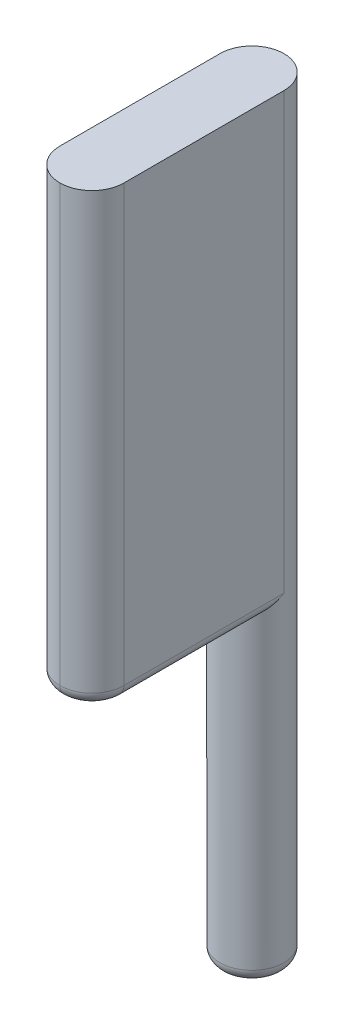
ISO-10303-21;
HEADER;
FILE_DESCRIPTION(('STEP AP214'),'2;1');
FILE_NAME('part.step','',(''),(''),'','','');
FILE_SCHEMA(('AUTOMOTIVE_DESIGN { 1 0 10303 214 1 1 1 1 }'));
ENDSEC;
DATA;
#1=APPLICATION_CONTEXT('core data for automotive mechanical design processes');
#2=APPLICATION_PROTOCOL_DEFINITION('international standard','automotive_design',2000,#1);
#3=PRODUCT_CONTEXT('',#1,'mechanical');
#4=PRODUCT('Part','Part','',(#3));
#5=PRODUCT_RELATED_PRODUCT_CATEGORY('part','',(#4));
#6=PRODUCT_DEFINITION_FORMATION('','',#4);
#7=PRODUCT_DEFINITION_CONTEXT('part definition',#1,'design');
#8=PRODUCT_DEFINITION('design','',#6,#7);
#9=PRODUCT_DEFINITION_SHAPE('','',#8);
#10=(LENGTH_UNIT() NAMED_UNIT(*) SI_UNIT(.MILLI.,.METRE.));
#11=(NAMED_UNIT(*) PLANE_ANGLE_UNIT() SI_UNIT($,.RADIAN.));
#12=(NAMED_UNIT(*) SI_UNIT($,.STERADIAN.) SOLID_ANGLE_UNIT());
#13=UNCERTAINTY_MEASURE_WITH_UNIT(LENGTH_MEASURE(1.E-05),#10,'distance_accuracy_value','');
#14=(GEOMETRIC_REPRESENTATION_CONTEXT(3) GLOBAL_UNCERTAINTY_ASSIGNED_CONTEXT((#13)) GLOBAL_UNIT_ASSIGNED_CONTEXT((#10,
#11,#12)) REPRESENTATION_CONTEXT('',''));
#15=CARTESIAN_POINT('',(0.,0.,0.));
#16=DIRECTION('',(0.,0.,1.));
#17=DIRECTION('',(1.,0.,0.));
#18=AXIS2_PLACEMENT_3D('',#15,#16,#17);
#19=CARTESIAN_POINT('',(0.,50.,0.));
#20=DIRECTION('',(0.,-1.,0.));
#21=DIRECTION('',(0.,0.,-1.));
#22=AXIS2_PLACEMENT_3D('',#19,#20,#21);
#23=CYLINDRICAL_SURFACE('',#22,5.);
#24=CARTESIAN_POINT('',(0.,2.,0.));
#25=DIRECTION('',(0.,1.,0.));
#26=DIRECTION('',(0.,0.,1.));
#27=AXIS2_PLACEMENT_3D('',#24,#25,#26);
#28=CIRCLE('',#27,5.);
#29=CARTESIAN_POINT('',(0.,2.,5.));
#30=VERTEX_POINT('',#29);
#31=EDGE_CURVE('E53',#30,#30,#28,.T.);
#32=ORIENTED_EDGE('',*,*,#31,.T.);
#33=EDGE_LOOP('',(#32));
#34=FACE_BOUND('',#33,.T.);
#35=CARTESIAN_POINT('',(0.,50.,0.));
#36=DIRECTION('',(0.,1.,0.));
#37=DIRECTION('',(0.,0.,1.));
#38=AXIS2_PLACEMENT_3D('',#35,#36,#37);
#39=CIRCLE('',#38,5.);
#40=CARTESIAN_POINT('',(-3.,50.,4.));
#41=VERTEX_POINT('',#40);
#42=CARTESIAN_POINT('',(3.,50.,4.));
#43=VERTEX_POINT('',#42);
#44=EDGE_CURVE('E137',#41,#43,#39,.T.);
#45=ORIENTED_EDGE('',*,*,#44,.F.);
#46=CARTESIAN_POINT('',(-3.,50.,4.));
#47=CARTESIAN_POINT('',(-3.06841415568073,50.0000067597266,3.94870806106206));
#48=CARTESIAN_POINT('',(-3.13544178147233,50.0035084279663,3.89567780949558));
#49=CARTESIAN_POINT('',(-3.26623698046415,50.0167109029042,3.78667268966545));
#50=CARTESIAN_POINT('',(-3.33000998817647,50.0264009844002,3.7307030693738));
#51=CARTESIAN_POINT('',(-3.45345849275947,50.0510771872825,3.6167152356291));
#52=CARTESIAN_POINT('',(-3.51316717694485,50.0660120904686,3.5587215528404));
#53=CARTESIAN_POINT('',(-3.62899797327076,50.1005222748414,3.44052676175929));
#54=CARTESIAN_POINT('',(-3.6851179564377,50.1201002786803,3.38032437588784));
#55=CARTESIAN_POINT('',(-3.81667715394248,50.1724441490579,3.23210856196807));
#56=CARTESIAN_POINT('',(-3.89021381861328,50.2072814247064,3.14313020633906));
#57=CARTESIAN_POINT('',(-4.02970569237115,50.2836005848064,2.96218509659868));
#58=CARTESIAN_POINT('',(-4.09565901066883,50.325084120255,2.87021760449279));
#59=CARTESIAN_POINT('',(-4.28302669874672,50.4581112195822,2.58967431946512));
#60=CARTESIAN_POINT('',(-4.39316815051751,50.5578938926857,2.39735118917236));
#61=CARTESIAN_POINT('',(-4.5567151501454,50.7402635992436,2.06399319131208));
#62=CARTESIAN_POINT('',(-4.61729455445876,50.8193534892754,1.9243958449696));
#63=CARTESIAN_POINT('',(-4.72477714964674,50.982793757942,1.6429135419546));
#64=CARTESIAN_POINT('',(-4.77167431748921,51.0671464335245,1.50102760674192));
#65=CARTESIAN_POINT('',(-4.85212411478637,51.2393114336602,1.21604872631645));
#66=CARTESIAN_POINT('',(-4.88570430530138,51.3271161950798,1.07295890653981));
#67=CARTESIAN_POINT('',(-4.9400142689418,51.5050321913334,0.785872581547719));
#68=CARTESIAN_POINT('',(-4.96074815389477,51.5951426785276,0.641876381367769));
#69=CARTESIAN_POINT('',(-4.99134748280353,51.787554785683,0.335925881978296));
#70=CARTESIAN_POINT('',(-4.99959869260943,51.8900148896151,0.173902220000234));
#71=CARTESIAN_POINT('',(-4.99999523540725,51.994960502319,0.00796814648684652));
#72=CARTESIAN_POINT('',(-4.99999999704777,51.9974802675754,0.00398404784954117));
#73=CARTESIAN_POINT('',(-5.,52.,0.));
#74=B_SPLINE_CURVE_WITH_KNOTS('',3,(#46,#47,#48,#49,#50,#51,#52,#53,#54,#55,#56,#57,#58,#59,#60,
#61,#62,#63,#64,#65,#66,#67,#68,#69,#70,#71,#72,#73),.UNSPECIFIED.,.F.,.F.,(4,2,2,2,2,2,2,2,2,2,
2,2,2,4),(0.,0.256323586120879,0.512204136350949,0.765652360303691,1.01924957198092,
1.38041574025909,1.74167176531566,2.46784096790537,2.9817850181479,3.49595497056344,
4.00905516339228,4.5219910388693,5.09684964624113,5.11099178908029),.UNSPECIFIED.);
#75=CARTESIAN_POINT('',(-5.,52.,0.));
#76=VERTEX_POINT('',#75);
#77=EDGE_CURVE('E135',#41,#76,#74,.T.);
#78=ORIENTED_EDGE('',*,*,#77,.T.);
#79=DIRECTION('',(0.,-1.,0.));
#80=VECTOR('',#79,1.);
#81=CARTESIAN_POINT('',(-5.,120.,0.));
#82=LINE('',#81,#80);
#83=CARTESIAN_POINT('',(-5.,120.,0.));
#84=VERTEX_POINT('',#83);
#85=EDGE_CURVE('E115',#84,#76,#82,.T.);
#86=ORIENTED_EDGE('',*,*,#85,.F.);
#87=CARTESIAN_POINT('',(0.,120.,0.));
#88=DIRECTION('',(0.,1.,0.));
#89=DIRECTION('',(0.,0.,-1.));
#90=AXIS2_PLACEMENT_3D('',#87,#88,#89);
#91=CIRCLE('',#90,5.);
#92=CARTESIAN_POINT('',(5.,120.,0.));
#93=VERTEX_POINT('',#92);
#94=EDGE_CURVE('E124',#93,#84,#91,.T.);
#95=ORIENTED_EDGE('',*,*,#94,.F.);
#96=DIRECTION('',(0.,-1.,0.));
#97=VECTOR('',#96,1.);
#98=CARTESIAN_POINT('',(5.,120.,0.));
#99=LINE('',#98,#97);
#100=CARTESIAN_POINT('',(5.,52.,0.));
#101=VERTEX_POINT('',#100);
#102=EDGE_CURVE('E138',#93,#101,#99,.T.);
#103=ORIENTED_EDGE('',*,*,#102,.T.);
#104=CARTESIAN_POINT('',(3.,50.,4.));
#105=CARTESIAN_POINT('',(3.06841415568073,50.0000067597266,3.94870806106206));
#106=CARTESIAN_POINT('',(3.13544178147233,50.0035084279663,3.89567780949558));
#107=CARTESIAN_POINT('',(3.26623698046415,50.0167109029042,3.78667268966545));
#108=CARTESIAN_POINT('',(3.33000998817647,50.0264009844002,3.7307030693738));
#109=CARTESIAN_POINT('',(3.45345849275947,50.0510771872825,3.6167152356291));
#110=CARTESIAN_POINT('',(3.51316717694485,50.0660120904686,3.5587215528404));
#111=CARTESIAN_POINT('',(3.62899797327076,50.1005222748414,3.44052676175929));
#112=CARTESIAN_POINT('',(3.6851179564377,50.1201002786803,3.38032437588784));
#113=CARTESIAN_POINT('',(3.81667715394249,50.1724441490579,3.23210856196807));
#114=CARTESIAN_POINT('',(3.89021381861328,50.2072814247064,3.14313020633906));
#115=CARTESIAN_POINT('',(4.02970569237115,50.2836005848064,2.96218509659868));
#116=CARTESIAN_POINT('',(4.09565901066883,50.325084120255,2.87021760449279));
#117=CARTESIAN_POINT('',(4.28302669874672,50.4581112195822,2.58967431946512));
#118=CARTESIAN_POINT('',(4.39316815051751,50.5578938926857,2.39735118917236));
#119=CARTESIAN_POINT('',(4.5567151501454,50.7402635992436,2.06399319131208));
#120=CARTESIAN_POINT('',(4.61729455445876,50.8193534892754,1.92439584496959));
#121=CARTESIAN_POINT('',(4.72477714964674,50.982793757942,1.6429135419546));
#122=CARTESIAN_POINT('',(4.77167431748921,51.0671464335245,1.50102760674192));
#123=CARTESIAN_POINT('',(4.85212411478638,51.2393114336602,1.21604872631644));
#124=CARTESIAN_POINT('',(4.88570430530138,51.3271161950798,1.07295890653981));
#125=CARTESIAN_POINT('',(4.94001426894181,51.5050321913334,0.785872581547716));
#126=CARTESIAN_POINT('',(4.96074815389477,51.5951426785276,0.641876381367767));
#127=CARTESIAN_POINT('',(4.99134748280353,51.787554785683,0.335925881978295));
#128=CARTESIAN_POINT('',(4.99959869260943,51.8900148896151,0.173902220000233));
#129=CARTESIAN_POINT('',(4.99999523540725,51.994960502319,0.00796814648684584));
#130=CARTESIAN_POINT('',(4.99999999704777,51.9974802675754,0.00398404784954047));
#131=CARTESIAN_POINT('',(5.,52.,0.));
#132=B_SPLINE_CURVE_WITH_KNOTS('',3,(#104,#105,#106,#107,#108,#109,#110,#111,#112,#113,#114,
#115,#116,#117,#118,#119,#120,#121,#122,#123,#124,#125,#126,#127,#128,#129,#130,#131),
.UNSPECIFIED.,.F.,.F.,(4,2,2,2,2,2,2,2,2,2,2,2,2,4),(0.,0.256323586120879,0.512204136350949,
0.765652360303693,1.01924957198092,1.38041574025909,1.74167176531567,2.46784096790537,
2.9817850181479,3.49595497056345,4.00905516339229,4.5219910388693,5.09684964624113,
5.11099178908029),.UNSPECIFIED.);
#133=EDGE_CURVE('E191',#101,#43,#132,.F.);
#134=ORIENTED_EDGE('',*,*,#133,.T.);
#135=EDGE_LOOP('',(#45,#78,#86,#95,#103,#134));
#136=FACE_BOUND('',#135,.T.);
#137=ADVANCED_FACE('F44',(#34,#136),#23,.T.);
#138=CARTESIAN_POINT('',(0.,0.,0.));
#139=DIRECTION('',(0.,1.,0.));
#140=DIRECTION('',(0.,0.,1.));
#141=AXIS2_PLACEMENT_3D('',#138,#139,#140);
#142=PLANE('',#141);
#143=CARTESIAN_POINT('',(0.,0.,0.));
#144=DIRECTION('',(0.,1.,0.));
#145=DIRECTION('',(0.,0.,1.));
#146=AXIS2_PLACEMENT_3D('',#143,#144,#145);
#147=CIRCLE('',#146,3.);
#148=CARTESIAN_POINT('',(0.,0.,3.));
#149=VERTEX_POINT('',#148);
#150=EDGE_CURVE('E11',#149,#149,#147,.F.);
#151=ORIENTED_EDGE('',*,*,#150,.T.);
#152=EDGE_LOOP('',(#151));
#153=FACE_BOUND('',#152,.T.);
#154=ADVANCED_FACE('F225',(#153),#142,.F.);
#155=CARTESIAN_POINT('',(-5.,120.,0.));
#156=DIRECTION('',(1.,0.,0.));
#157=DIRECTION('',(0.,0.,-1.));
#158=AXIS2_PLACEMENT_3D('',#155,#156,#157);
#159=PLANE('',#158);
#160=ORIENTED_EDGE('',*,*,#85,.T.);
#161=DIRECTION('',(0.,0.,1.));
#162=VECTOR('',#161,1.);
#163=CARTESIAN_POINT('',(-5.,52.,25.));
#164=LINE('',#163,#162);
#165=CARTESIAN_POINT('',(-5.,52.,25.));
#166=VERTEX_POINT('',#165);
#167=EDGE_CURVE('E158',#76,#166,#164,.T.);
#168=ORIENTED_EDGE('',*,*,#167,.T.);
#169=DIRECTION('',(0.,-1.,0.));
#170=VECTOR('',#169,1.);
#171=CARTESIAN_POINT('',(-5.,120.,25.));
#172=LINE('',#171,#170);
#173=CARTESIAN_POINT('',(-5.,120.,25.));
#174=VERTEX_POINT('',#173);
#175=EDGE_CURVE('E118',#166,#174,#172,.F.);
#176=ORIENTED_EDGE('',*,*,#175,.T.);
#177=DIRECTION('',(0.,0.,1.));
#178=VECTOR('',#177,1.);
#179=CARTESIAN_POINT('',(-5.,120.,0.));
#180=LINE('',#179,#178);
#181=EDGE_CURVE('E110',#84,#174,#180,.T.);
#182=ORIENTED_EDGE('',*,*,#181,.F.);
#183=EDGE_LOOP('',(#160,#168,#176,#182));
#184=FACE_BOUND('',#183,.T.);
#185=ADVANCED_FACE('F112',(#184),#159,.F.);
#186=CARTESIAN_POINT('',(5.,120.,30.));
#187=DIRECTION('',(-1.,0.,0.));
#188=DIRECTION('',(0.,0.,1.));
#189=AXIS2_PLACEMENT_3D('',#186,#187,#188);
#190=PLANE('',#189);
#191=DIRECTION('',(0.,-1.,0.));
#192=VECTOR('',#191,1.);
#193=CARTESIAN_POINT('',(5.,120.,25.));
#194=LINE('',#193,#192);
#195=CARTESIAN_POINT('',(5.,120.,25.));
#196=VERTEX_POINT('',#195);
#197=CARTESIAN_POINT('',(5.,52.,25.));
#198=VERTEX_POINT('',#197);
#199=EDGE_CURVE('E155',#196,#198,#194,.T.);
#200=ORIENTED_EDGE('',*,*,#199,.T.);
#201=DIRECTION('',(0.,0.,-1.));
#202=VECTOR('',#201,1.);
#203=CARTESIAN_POINT('',(5.,52.,0.));
#204=LINE('',#203,#202);
#205=EDGE_CURVE('E60',#198,#101,#204,.T.);
#206=ORIENTED_EDGE('',*,*,#205,.T.);
#207=ORIENTED_EDGE('',*,*,#102,.F.);
#208=DIRECTION('',(0.,0.,-1.));
#209=VECTOR('',#208,1.);
#210=CARTESIAN_POINT('',(5.,120.,30.));
#211=LINE('',#210,#209);
#212=EDGE_CURVE('E123',#196,#93,#211,.T.);
#213=ORIENTED_EDGE('',*,*,#212,.F.);
#214=EDGE_LOOP('',(#200,#206,#207,#213));
#215=FACE_BOUND('',#214,.T.);
#216=ADVANCED_FACE('F251',(#215),#190,.F.);
#217=CARTESIAN_POINT('',(0.,120.,0.));
#218=DIRECTION('',(0.,-1.,0.));
#219=DIRECTION('',(0.,0.,-1.));
#220=AXIS2_PLACEMENT_3D('',#217,#218,#219);
#221=PLANE('',#220);
#222=ORIENTED_EDGE('',*,*,#181,.T.);
#223=CARTESIAN_POINT('',(0.,120.,25.));
#224=DIRECTION('',(0.,-1.,0.));
#225=DIRECTION('',(0.,0.,-1.));
#226=AXIS2_PLACEMENT_3D('',#223,#224,#225);
#227=CIRCLE('',#226,5.);
#228=CARTESIAN_POINT('',(0.,120.,30.));
#229=VERTEX_POINT('',#228);
#230=EDGE_CURVE('E152',#174,#229,#227,.F.);
#231=ORIENTED_EDGE('',*,*,#230,.T.);
#232=CARTESIAN_POINT('',(0.,120.,25.));
#233=DIRECTION('',(0.,-1.,0.));
#234=DIRECTION('',(0.,0.,-1.));
#235=AXIS2_PLACEMENT_3D('',#232,#233,#234);
#236=CIRCLE('',#235,5.);
#237=EDGE_CURVE('E149',#229,#196,#236,.F.);
#238=ORIENTED_EDGE('',*,*,#237,.T.);
#239=ORIENTED_EDGE('',*,*,#212,.T.);
#240=ORIENTED_EDGE('',*,*,#94,.T.);
#241=EDGE_LOOP('',(#222,#231,#238,#239,#240));
#242=FACE_BOUND('',#241,.T.);
#243=ADVANCED_FACE('F127',(#242),#221,.F.);
#244=CARTESIAN_POINT('',(0.,50.,0.));
#245=DIRECTION('',(0.,-1.,0.));
#246=DIRECTION('',(0.,0.,-1.));
#247=AXIS2_PLACEMENT_3D('',#244,#245,#246);
#248=PLANE('',#247);
#249=CARTESIAN_POINT('',(0.,50.,25.));
#250=DIRECTION('',(0.,-1.,0.));
#251=DIRECTION('',(0.,0.,-1.));
#252=AXIS2_PLACEMENT_3D('',#249,#250,#251);
#253=CIRCLE('',#252,3.);
#254=CARTESIAN_POINT('',(0.,50.,28.));
#255=VERTEX_POINT('',#254);
#256=CARTESIAN_POINT('',(-3.,50.,25.));
#257=VERTEX_POINT('',#256);
#258=EDGE_CURVE('E170',#255,#257,#253,.T.);
#259=ORIENTED_EDGE('',*,*,#258,.T.);
#260=DIRECTION('',(0.,0.,1.));
#261=VECTOR('',#260,1.);
#262=CARTESIAN_POINT('',(-3.,50.,0.));
#263=LINE('',#262,#261);
#264=EDGE_CURVE('E173',#257,#41,#263,.F.);
#265=ORIENTED_EDGE('',*,*,#264,.T.);
#266=ORIENTED_EDGE('',*,*,#44,.T.);
#267=DIRECTION('',(0.,0.,-1.));
#268=VECTOR('',#267,1.);
#269=CARTESIAN_POINT('',(3.,50.,25.));
#270=LINE('',#269,#268);
#271=CARTESIAN_POINT('',(3.,50.,25.));
#272=VERTEX_POINT('',#271);
#273=EDGE_CURVE('E164',#43,#272,#270,.F.);
#274=ORIENTED_EDGE('',*,*,#273,.T.);
#275=CARTESIAN_POINT('',(0.,50.,25.));
#276=DIRECTION('',(0.,-1.,0.));
#277=DIRECTION('',(0.,0.,-1.));
#278=AXIS2_PLACEMENT_3D('',#275,#276,#277);
#279=CIRCLE('',#278,3.);
#280=EDGE_CURVE('E167',#272,#255,#279,.T.);
#281=ORIENTED_EDGE('',*,*,#280,.T.);
#282=EDGE_LOOP('',(#259,#265,#266,#274,#281));
#283=FACE_BOUND('',#282,.T.);
#284=ADVANCED_FACE('F256',(#283),#248,.T.);
#285=CARTESIAN_POINT('',(0.,120.,25.));
#286=DIRECTION('',(0.,-1.,0.));
#287=DIRECTION('',(0.,0.,-1.));
#288=AXIS2_PLACEMENT_3D('',#285,#286,#287);
#289=CYLINDRICAL_SURFACE('',#288,5.);
#290=DIRECTION('',(0.,-1.,0.));
#291=VECTOR('',#290,1.);
#292=CARTESIAN_POINT('',(0.,120.,30.));
#293=LINE('',#292,#291);
#294=CARTESIAN_POINT('',(0.,52.,30.));
#295=VERTEX_POINT('',#294);
#296=EDGE_CURVE('E131',#295,#229,#293,.F.);
#297=ORIENTED_EDGE('',*,*,#296,.F.);
#298=CARTESIAN_POINT('',(0.,52.,25.));
#299=DIRECTION('',(0.,-1.,0.));
#300=DIRECTION('',(0.,0.,-1.));
#301=AXIS2_PLACEMENT_3D('',#298,#299,#300);
#302=CIRCLE('',#301,5.);
#303=EDGE_CURVE('E68',#295,#198,#302,.F.);
#304=ORIENTED_EDGE('',*,*,#303,.T.);
#305=ORIENTED_EDGE('',*,*,#199,.F.);
#306=ORIENTED_EDGE('',*,*,#237,.F.);
#307=EDGE_LOOP('',(#297,#304,#305,#306));
#308=FACE_BOUND('',#307,.T.);
#309=ADVANCED_FACE('F207',(#308),#289,.T.);
#310=CARTESIAN_POINT('',(0.,120.,25.));
#311=DIRECTION('',(0.,-1.,0.));
#312=DIRECTION('',(0.,0.,-1.));
#313=AXIS2_PLACEMENT_3D('',#310,#311,#312);
#314=CYLINDRICAL_SURFACE('',#313,5.);
#315=ORIENTED_EDGE('',*,*,#175,.F.);
#316=CARTESIAN_POINT('',(0.,52.,25.));
#317=DIRECTION('',(0.,-1.,0.));
#318=DIRECTION('',(0.,0.,-1.));
#319=AXIS2_PLACEMENT_3D('',#316,#317,#318);
#320=CIRCLE('',#319,5.);
#321=EDGE_CURVE('E176',#166,#295,#320,.F.);
#322=ORIENTED_EDGE('',*,*,#321,.T.);
#323=ORIENTED_EDGE('',*,*,#296,.T.);
#324=ORIENTED_EDGE('',*,*,#230,.F.);
#325=EDGE_LOOP('',(#315,#322,#323,#324));
#326=FACE_BOUND('',#325,.T.);
#327=ADVANCED_FACE('F217',(#326),#314,.T.);
#328=CARTESIAN_POINT('',(3.,52.,30.));
#329=DIRECTION('',(0.,0.,1.));
#330=DIRECTION('',(1.,0.,0.));
#331=AXIS2_PLACEMENT_3D('',#328,#329,#330);
#332=CYLINDRICAL_SURFACE('',#331,2.);
#333=ORIENTED_EDGE('',*,*,#133,.F.);
#334=ORIENTED_EDGE('',*,*,#205,.F.);
#335=CARTESIAN_POINT('',(3.,52.,25.));
#336=DIRECTION('',(0.,0.,1.));
#337=DIRECTION('',(1.,0.,0.));
#338=AXIS2_PLACEMENT_3D('',#335,#336,#337);
#339=CIRCLE('',#338,2.);
#340=EDGE_CURVE('E161',#272,#198,#339,.T.);
#341=ORIENTED_EDGE('',*,*,#340,.F.);
#342=ORIENTED_EDGE('',*,*,#273,.F.);
#343=EDGE_LOOP('',(#333,#334,#341,#342));
#344=FACE_BOUND('',#343,.T.);
#345=ADVANCED_FACE('F213',(#344),#332,.T.);
#346=CARTESIAN_POINT('',(0.,52.,25.));
#347=DIRECTION('',(0.,-1.,0.));
#348=DIRECTION('',(0.,0.,-1.));
#349=AXIS2_PLACEMENT_3D('',#346,#347,#348);
#350=TOROIDAL_SURFACE('',#349,3.,2.);
#351=ORIENTED_EDGE('',*,*,#340,.T.);
#352=ORIENTED_EDGE('',*,*,#303,.F.);
#353=CARTESIAN_POINT('',(0.,52.,28.));
#354=DIRECTION('',(-1.,0.,0.));
#355=DIRECTION('',(0.,0.,1.));
#356=AXIS2_PLACEMENT_3D('',#353,#354,#355);
#357=CIRCLE('',#356,2.);
#358=EDGE_CURVE('E240',#255,#295,#357,.T.);
#359=ORIENTED_EDGE('',*,*,#358,.F.);
#360=ORIENTED_EDGE('',*,*,#280,.F.);
#361=EDGE_LOOP('',(#351,#352,#359,#360));
#362=FACE_BOUND('',#361,.T.);
#363=ADVANCED_FACE('F210',(#362),#350,.T.);
#364=CARTESIAN_POINT('',(0.,52.,25.));
#365=DIRECTION('',(0.,-1.,0.));
#366=DIRECTION('',(0.,0.,-1.));
#367=AXIS2_PLACEMENT_3D('',#364,#365,#366);
#368=TOROIDAL_SURFACE('',#367,3.,2.);
#369=ORIENTED_EDGE('',*,*,#358,.T.);
#370=ORIENTED_EDGE('',*,*,#321,.F.);
#371=CARTESIAN_POINT('',(-3.,52.,25.));
#372=DIRECTION('',(0.,0.,-1.));
#373=DIRECTION('',(-1.,0.,0.));
#374=AXIS2_PLACEMENT_3D('',#371,#372,#373);
#375=CIRCLE('',#374,2.);
#376=EDGE_CURVE('E243',#257,#166,#375,.T.);
#377=ORIENTED_EDGE('',*,*,#376,.F.);
#378=ORIENTED_EDGE('',*,*,#258,.F.);
#379=EDGE_LOOP('',(#369,#370,#377,#378));
#380=FACE_BOUND('',#379,.T.);
#381=ADVANCED_FACE('F205',(#380),#368,.T.);
#382=CARTESIAN_POINT('',(-3.,52.,0.));
#383=DIRECTION('',(0.,0.,-1.));
#384=DIRECTION('',(-1.,0.,0.));
#385=AXIS2_PLACEMENT_3D('',#382,#383,#384);
#386=CYLINDRICAL_SURFACE('',#385,2.);
#387=ORIENTED_EDGE('',*,*,#77,.F.);
#388=ORIENTED_EDGE('',*,*,#264,.F.);
#389=ORIENTED_EDGE('',*,*,#376,.T.);
#390=ORIENTED_EDGE('',*,*,#167,.F.);
#391=EDGE_LOOP('',(#387,#388,#389,#390));
#392=FACE_BOUND('',#391,.T.);
#393=ADVANCED_FACE('F200',(#392),#386,.T.);
#394=CARTESIAN_POINT('',(0.,2.,0.));
#395=DIRECTION('',(0.,1.,0.));
#396=DIRECTION('',(0.,0.,1.));
#397=AXIS2_PLACEMENT_3D('',#394,#395,#396);
#398=TOROIDAL_SURFACE('',#397,3.,2.);
#399=ORIENTED_EDGE('',*,*,#150,.F.);
#400=EDGE_LOOP('',(#399));
#401=FACE_BOUND('',#400,.T.);
#402=ORIENTED_EDGE('',*,*,#31,.F.);
#403=EDGE_LOOP('',(#402));
#404=FACE_BOUND('',#403,.T.);
#405=ADVANCED_FACE('F46',(#401,#404),#398,.T.);
#406=CLOSED_SHELL('',(#137,#154,#185,#216,#243,#284,#309,#327,#345,#363,#381,#393,#405));
#407=MANIFOLD_SOLID_BREP('B2',#406);
#408=ADVANCED_BREP_SHAPE_REPRESENTATION('',(#18,#407),#14);
#409=SHAPE_DEFINITION_REPRESENTATION(#9,#408);
ENDSEC;
END-ISO-10303-21;
